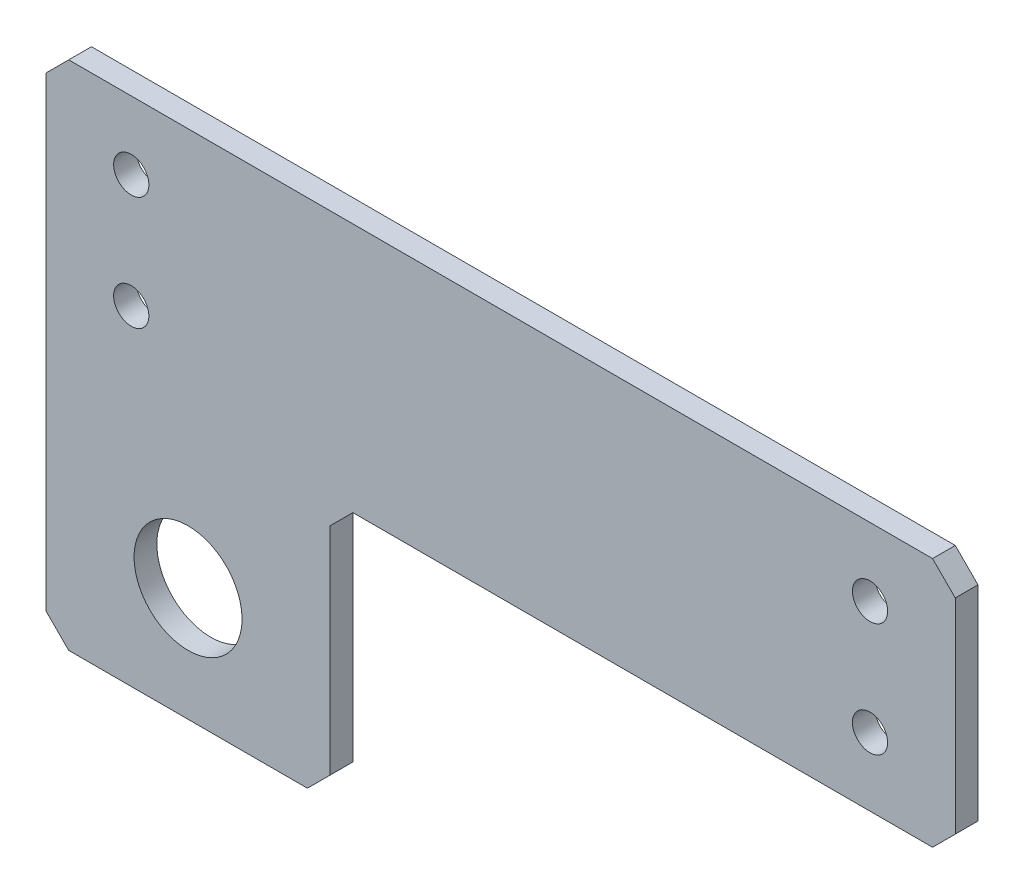
ISO-10303-21;
HEADER;
FILE_DESCRIPTION(('STEP AP214'),'2;1');
FILE_NAME('part.step','',(''),(''),'','','');
FILE_SCHEMA(('AUTOMOTIVE_DESIGN { 1 0 10303 214 1 1 1 1 }'));
ENDSEC;
DATA;
#1=APPLICATION_CONTEXT('core data for automotive mechanical design processes');
#2=APPLICATION_PROTOCOL_DEFINITION('international standard','automotive_design',2000,#1);
#3=PRODUCT_CONTEXT('',#1,'mechanical');
#4=PRODUCT('Part','Part','',(#3));
#5=PRODUCT_RELATED_PRODUCT_CATEGORY('part','',(#4));
#6=PRODUCT_DEFINITION_FORMATION('','',#4);
#7=PRODUCT_DEFINITION_CONTEXT('part definition',#1,'design');
#8=PRODUCT_DEFINITION('design','',#6,#7);
#9=PRODUCT_DEFINITION_SHAPE('','',#8);
#10=(LENGTH_UNIT() NAMED_UNIT(*) SI_UNIT(.MILLI.,.METRE.));
#11=(NAMED_UNIT(*) PLANE_ANGLE_UNIT() SI_UNIT($,.RADIAN.));
#12=(NAMED_UNIT(*) SI_UNIT($,.STERADIAN.) SOLID_ANGLE_UNIT());
#13=UNCERTAINTY_MEASURE_WITH_UNIT(LENGTH_MEASURE(1.E-05),#10,'distance_accuracy_value','');
#14=(GEOMETRIC_REPRESENTATION_CONTEXT(3) GLOBAL_UNCERTAINTY_ASSIGNED_CONTEXT((#13)) GLOBAL_UNIT_ASSIGNED_CONTEXT((#10,
#11,#12)) REPRESENTATION_CONTEXT('',''));
#15=CARTESIAN_POINT('',(0.,0.,0.));
#16=DIRECTION('',(0.,0.,1.));
#17=DIRECTION('',(1.,0.,0.));
#18=AXIS2_PLACEMENT_3D('',#15,#16,#17);
#19=CARTESIAN_POINT('',(-65.,8.,0.));
#20=DIRECTION('',(0.,0.,1.));
#21=DIRECTION('',(1.,0.,0.));
#22=AXIS2_PLACEMENT_3D('',#19,#20,#21);
#23=CYLINDRICAL_SURFACE('',#22,3.1);
#24=CARTESIAN_POINT('',(-65.,8.,0.));
#25=DIRECTION('',(0.,0.,1.));
#26=DIRECTION('',(1.,0.,0.));
#27=AXIS2_PLACEMENT_3D('',#24,#25,#26);
#28=CIRCLE('',#27,3.1);
#29=CARTESIAN_POINT('',(-61.9,8.,0.));
#30=VERTEX_POINT('',#29);
#31=EDGE_CURVE('E210',#30,#30,#28,.T.);
#32=ORIENTED_EDGE('',*,*,#31,.F.);
#33=EDGE_LOOP('',(#32));
#34=FACE_BOUND('',#33,.T.);
#35=CARTESIAN_POINT('',(-65.,8.,4.));
#36=DIRECTION('',(0.,0.,1.));
#37=DIRECTION('',(1.,0.,0.));
#38=AXIS2_PLACEMENT_3D('',#35,#36,#37);
#39=CIRCLE('',#38,3.1);
#40=CARTESIAN_POINT('',(-61.9,8.,4.));
#41=VERTEX_POINT('',#40);
#42=EDGE_CURVE('E213',#41,#41,#39,.T.);
#43=ORIENTED_EDGE('',*,*,#42,.T.);
#44=EDGE_LOOP('',(#43));
#45=FACE_BOUND('',#44,.T.);
#46=ADVANCED_FACE('F39',(#34,#45),#23,.F.);
#47=CARTESIAN_POINT('',(-65.,28.,0.));
#48=DIRECTION('',(0.,0.,1.));
#49=DIRECTION('',(1.,0.,0.));
#50=AXIS2_PLACEMENT_3D('',#47,#48,#49);
#51=CYLINDRICAL_SURFACE('',#50,3.1);
#52=CARTESIAN_POINT('',(-65.,28.,0.));
#53=DIRECTION('',(0.,0.,1.));
#54=DIRECTION('',(1.,0.,0.));
#55=AXIS2_PLACEMENT_3D('',#52,#53,#54);
#56=CIRCLE('',#55,3.1);
#57=CARTESIAN_POINT('',(-61.9,28.,0.));
#58=VERTEX_POINT('',#57);
#59=EDGE_CURVE('E199',#58,#58,#56,.T.);
#60=ORIENTED_EDGE('',*,*,#59,.F.);
#61=EDGE_LOOP('',(#60));
#62=FACE_BOUND('',#61,.T.);
#63=CARTESIAN_POINT('',(-65.,28.,4.));
#64=DIRECTION('',(0.,0.,1.));
#65=DIRECTION('',(1.,0.,0.));
#66=AXIS2_PLACEMENT_3D('',#63,#64,#65);
#67=CIRCLE('',#66,3.1);
#68=CARTESIAN_POINT('',(-61.9,28.,4.));
#69=VERTEX_POINT('',#68);
#70=EDGE_CURVE('E207',#69,#69,#67,.T.);
#71=ORIENTED_EDGE('',*,*,#70,.T.);
#72=EDGE_LOOP('',(#71));
#73=FACE_BOUND('',#72,.T.);
#74=ADVANCED_FACE('F300',(#62,#73),#51,.F.);
#75=CARTESIAN_POINT('',(80.,-40.,4.));
#76=DIRECTION('',(-1.,0.,0.));
#77=DIRECTION('',(0.,0.,1.));
#78=AXIS2_PLACEMENT_3D('',#75,#76,#77);
#79=PLANE('',#78);
#80=DIRECTION('',(0.,1.,0.));
#81=VECTOR('',#80,1.);
#82=CARTESIAN_POINT('',(80.,-40.,4.));
#83=LINE('',#82,#81);
#84=CARTESIAN_POINT('',(80.,0.,4.));
#85=VERTEX_POINT('',#84);
#86=CARTESIAN_POINT('',(80.,36.,4.));
#87=VERTEX_POINT('',#86);
#88=EDGE_CURVE('E191',#85,#87,#83,.T.);
#89=ORIENTED_EDGE('',*,*,#88,.F.);
#90=DIRECTION('',(0.,0.,-1.));
#91=VECTOR('',#90,1.);
#92=CARTESIAN_POINT('',(80.,0.,4.));
#93=LINE('',#92,#91);
#94=CARTESIAN_POINT('',(80.,0.,0.));
#95=VERTEX_POINT('',#94);
#96=EDGE_CURVE('E247',#85,#95,#93,.T.);
#97=ORIENTED_EDGE('',*,*,#96,.T.);
#98=DIRECTION('',(0.,1.,0.));
#99=VECTOR('',#98,1.);
#100=CARTESIAN_POINT('',(80.,-40.,0.));
#101=LINE('',#100,#99);
#102=CARTESIAN_POINT('',(80.,36.,0.));
#103=VERTEX_POINT('',#102);
#104=EDGE_CURVE('E188',#95,#103,#101,.T.);
#105=ORIENTED_EDGE('',*,*,#104,.T.);
#106=DIRECTION('',(0.,0.,1.));
#107=VECTOR('',#106,1.);
#108=CARTESIAN_POINT('',(80.,36.,4.));
#109=LINE('',#108,#107);
#110=EDGE_CURVE('E245',#103,#87,#109,.T.);
#111=ORIENTED_EDGE('',*,*,#110,.T.);
#112=EDGE_LOOP('',(#89,#97,#105,#111));
#113=FACE_BOUND('',#112,.T.);
#114=ADVANCED_FACE('F287',(#113),#79,.F.);
#115=CARTESIAN_POINT('',(-80.,40.,4.));
#116=DIRECTION('',(0.,-1.,0.));
#117=DIRECTION('',(0.,0.,-1.));
#118=AXIS2_PLACEMENT_3D('',#115,#116,#117);
#119=PLANE('',#118);
#120=DIRECTION('',(-1.,0.,0.));
#121=VECTOR('',#120,1.);
#122=CARTESIAN_POINT('',(-80.,40.,4.));
#123=LINE('',#122,#121);
#124=CARTESIAN_POINT('',(76.,40.,4.));
#125=VERTEX_POINT('',#124);
#126=CARTESIAN_POINT('',(-76.,40.,4.));
#127=VERTEX_POINT('',#126);
#128=EDGE_CURVE('E193',#125,#127,#123,.T.);
#129=ORIENTED_EDGE('',*,*,#128,.F.);
#130=DIRECTION('',(0.,0.,-1.));
#131=VECTOR('',#130,1.);
#132=CARTESIAN_POINT('',(76.,40.,4.));
#133=LINE('',#132,#131);
#134=CARTESIAN_POINT('',(76.,40.,0.));
#135=VERTEX_POINT('',#134);
#136=EDGE_CURVE('E250',#125,#135,#133,.T.);
#137=ORIENTED_EDGE('',*,*,#136,.T.);
#138=DIRECTION('',(-1.,0.,0.));
#139=VECTOR('',#138,1.);
#140=CARTESIAN_POINT('',(-80.,40.,0.));
#141=LINE('',#140,#139);
#142=CARTESIAN_POINT('',(-76.,40.,0.));
#143=VERTEX_POINT('',#142);
#144=EDGE_CURVE('E202',#135,#143,#141,.T.);
#145=ORIENTED_EDGE('',*,*,#144,.T.);
#146=DIRECTION('',(0.,0.,1.));
#147=VECTOR('',#146,1.);
#148=CARTESIAN_POINT('',(-76.,40.,4.));
#149=LINE('',#148,#147);
#150=EDGE_CURVE('E55',#143,#127,#149,.T.);
#151=ORIENTED_EDGE('',*,*,#150,.T.);
#152=EDGE_LOOP('',(#129,#137,#145,#151));
#153=FACE_BOUND('',#152,.T.);
#154=ADVANCED_FACE('F278',(#153),#119,.F.);
#155=CARTESIAN_POINT('',(-80.,-40.,4.));
#156=DIRECTION('',(1.,0.,0.));
#157=DIRECTION('',(0.,0.,-1.));
#158=AXIS2_PLACEMENT_3D('',#155,#156,#157);
#159=PLANE('',#158);
#160=DIRECTION('',(0.,-1.,0.));
#161=VECTOR('',#160,1.);
#162=CARTESIAN_POINT('',(-80.,-40.,0.));
#163=LINE('',#162,#161);
#164=CARTESIAN_POINT('',(-80.,36.,0.));
#165=VERTEX_POINT('',#164);
#166=CARTESIAN_POINT('',(-80.,-46.,0.));
#167=VERTEX_POINT('',#166);
#168=EDGE_CURVE('E194',#165,#167,#163,.T.);
#169=ORIENTED_EDGE('',*,*,#168,.T.);
#170=DIRECTION('',(0.,0.,1.));
#171=VECTOR('',#170,1.);
#172=CARTESIAN_POINT('',(-80.,-46.,4.));
#173=LINE('',#172,#171);
#174=CARTESIAN_POINT('',(-80.,-46.,4.));
#175=VERTEX_POINT('',#174);
#176=EDGE_CURVE('E135',#167,#175,#173,.T.);
#177=ORIENTED_EDGE('',*,*,#176,.T.);
#178=DIRECTION('',(0.,-1.,0.));
#179=VECTOR('',#178,1.);
#180=CARTESIAN_POINT('',(-80.,-40.,4.));
#181=LINE('',#180,#179);
#182=CARTESIAN_POINT('',(-80.,36.,4.));
#183=VERTEX_POINT('',#182);
#184=EDGE_CURVE('E196',#183,#175,#181,.T.);
#185=ORIENTED_EDGE('',*,*,#184,.F.);
#186=DIRECTION('',(0.,0.,-1.));
#187=VECTOR('',#186,1.);
#188=CARTESIAN_POINT('',(-80.,36.,4.));
#189=LINE('',#188,#187);
#190=EDGE_CURVE('E140',#183,#165,#189,.T.);
#191=ORIENTED_EDGE('',*,*,#190,.T.);
#192=EDGE_LOOP('',(#169,#177,#185,#191));
#193=FACE_BOUND('',#192,.T.);
#194=ADVANCED_FACE('F275',(#193),#159,.F.);
#195=CARTESIAN_POINT('',(0.,0.,4.));
#196=DIRECTION('',(0.,0.,-1.));
#197=DIRECTION('',(-1.,0.,0.));
#198=AXIS2_PLACEMENT_3D('',#195,#196,#197);
#199=PLANE('',#198);
#200=CARTESIAN_POINT('',(-55.,-30.,4.));
#201=DIRECTION('',(0.,0.,1.));
#202=DIRECTION('',(1.,0.,0.));
#203=AXIS2_PLACEMENT_3D('',#200,#201,#202);
#204=CIRCLE('',#203,9.5);
#205=CARTESIAN_POINT('',(-45.5,-30.,4.));
#206=VERTEX_POINT('',#205);
#207=EDGE_CURVE('E164',#206,#206,#204,.T.);
#208=ORIENTED_EDGE('',*,*,#207,.F.);
#209=EDGE_LOOP('',(#208));
#210=FACE_BOUND('',#209,.T.);
#211=CARTESIAN_POINT('',(65.,8.,4.));
#212=DIRECTION('',(0.,0.,1.));
#213=DIRECTION('',(1.,0.,0.));
#214=AXIS2_PLACEMENT_3D('',#211,#212,#213);
#215=CIRCLE('',#214,3.1);
#216=CARTESIAN_POINT('',(68.1,8.,4.));
#217=VERTEX_POINT('',#216);
#218=EDGE_CURVE('E181',#217,#217,#215,.T.);
#219=ORIENTED_EDGE('',*,*,#218,.F.);
#220=EDGE_LOOP('',(#219));
#221=FACE_BOUND('',#220,.T.);
#222=CARTESIAN_POINT('',(65.,28.,4.));
#223=DIRECTION('',(0.,0.,1.));
#224=DIRECTION('',(1.,0.,0.));
#225=AXIS2_PLACEMENT_3D('',#222,#223,#224);
#226=CIRCLE('',#225,3.1);
#227=CARTESIAN_POINT('',(68.1,28.,4.));
#228=VERTEX_POINT('',#227);
#229=EDGE_CURVE('E184',#228,#228,#226,.T.);
#230=ORIENTED_EDGE('',*,*,#229,.F.);
#231=EDGE_LOOP('',(#230));
#232=FACE_BOUND('',#231,.T.);
#233=ORIENTED_EDGE('',*,*,#184,.T.);
#234=DIRECTION('',(-0.707106781186548,0.707106781186548,0.));
#235=VECTOR('',#234,1.);
#236=CARTESIAN_POINT('',(-76.,-50.,4.));
#237=LINE('',#236,#235);
#238=CARTESIAN_POINT('',(-76.,-50.,4.));
#239=VERTEX_POINT('',#238);
#240=EDGE_CURVE('E233',#175,#239,#237,.F.);
#241=ORIENTED_EDGE('',*,*,#240,.T.);
#242=DIRECTION('',(-1.,0.,0.));
#243=VECTOR('',#242,1.);
#244=CARTESIAN_POINT('',(-80.,-50.,4.));
#245=LINE('',#244,#243);
#246=CARTESIAN_POINT('',(-34.,-50.,4.));
#247=VERTEX_POINT('',#246);
#248=EDGE_CURVE('E151',#247,#239,#245,.T.);
#249=ORIENTED_EDGE('',*,*,#248,.F.);
#250=DIRECTION('',(-0.707106781186548,-0.707106781186548,0.));
#251=VECTOR('',#250,1.);
#252=CARTESIAN_POINT('',(-34.,-50.,4.));
#253=LINE('',#252,#251);
#254=CARTESIAN_POINT('',(-30.,-46.,4.));
#255=VERTEX_POINT('',#254);
#256=EDGE_CURVE('E231',#247,#255,#253,.F.);
#257=ORIENTED_EDGE('',*,*,#256,.T.);
#258=DIRECTION('',(0.,-1.,0.));
#259=VECTOR('',#258,1.);
#260=CARTESIAN_POINT('',(-30.,-4.00000000000002,4.));
#261=LINE('',#260,#259);
#262=CARTESIAN_POINT('',(-30.,-8.00000000000002,4.));
#263=VERTEX_POINT('',#262);
#264=EDGE_CURVE('E172',#263,#255,#261,.T.);
#265=ORIENTED_EDGE('',*,*,#264,.F.);
#266=DIRECTION('',(-0.707106781186545,-0.70710678118655,0.));
#267=VECTOR('',#266,1.);
#268=CARTESIAN_POINT('',(-11.0000000000001,11.,4.));
#269=LINE('',#268,#267);
#270=CARTESIAN_POINT('',(-26.,-4.00000000000002,4.));
#271=VERTEX_POINT('',#270);
#272=EDGE_CURVE('E48',#263,#271,#269,.F.);
#273=ORIENTED_EDGE('',*,*,#272,.T.);
#274=DIRECTION('',(-1.,0.,0.));
#275=VECTOR('',#274,1.);
#276=CARTESIAN_POINT('',(80.,-4.,4.));
#277=LINE('',#276,#275);
#278=CARTESIAN_POINT('',(76.,-4.,4.));
#279=VERTEX_POINT('',#278);
#280=EDGE_CURVE('E161',#279,#271,#277,.T.);
#281=ORIENTED_EDGE('',*,*,#280,.F.);
#282=DIRECTION('',(-0.707106781186545,-0.70710678118655,0.));
#283=VECTOR('',#282,1.);
#284=CARTESIAN_POINT('',(76.,-4.,4.));
#285=LINE('',#284,#283);
#286=EDGE_CURVE('E229',#279,#85,#285,.F.);
#287=ORIENTED_EDGE('',*,*,#286,.T.);
#288=ORIENTED_EDGE('',*,*,#88,.T.);
#289=DIRECTION('',(0.707106781186548,-0.707106781186548,0.));
#290=VECTOR('',#289,1.);
#291=CARTESIAN_POINT('',(76.,40.,4.));
#292=LINE('',#291,#290);
#293=EDGE_CURVE('E62',#87,#125,#292,.F.);
#294=ORIENTED_EDGE('',*,*,#293,.T.);
#295=ORIENTED_EDGE('',*,*,#128,.T.);
#296=DIRECTION('',(0.707106781186548,0.707106781186548,0.));
#297=VECTOR('',#296,1.);
#298=CARTESIAN_POINT('',(-80.,36.,4.));
#299=LINE('',#298,#297);
#300=EDGE_CURVE('E226',#127,#183,#299,.F.);
#301=ORIENTED_EDGE('',*,*,#300,.T.);
#302=EDGE_LOOP('',(#233,#241,#249,#257,#265,#273,#281,#287,#288,#294,#295,#301));
#303=FACE_BOUND('',#302,.T.);
#304=ORIENTED_EDGE('',*,*,#70,.F.);
#305=EDGE_LOOP('',(#304));
#306=FACE_BOUND('',#305,.T.);
#307=ORIENTED_EDGE('',*,*,#42,.F.);
#308=EDGE_LOOP('',(#307));
#309=FACE_BOUND('',#308,.T.);
#310=ADVANCED_FACE('F254',(#210,#221,#232,#303,#306,#309),#199,.F.);
#311=CARTESIAN_POINT('',(0.,0.,0.));
#312=DIRECTION('',(0.,0.,-1.));
#313=DIRECTION('',(-1.,0.,0.));
#314=AXIS2_PLACEMENT_3D('',#311,#312,#313);
#315=PLANE('',#314);
#316=CARTESIAN_POINT('',(-55.,-30.,0.));
#317=DIRECTION('',(0.,0.,1.));
#318=DIRECTION('',(1.,0.,0.));
#319=AXIS2_PLACEMENT_3D('',#316,#317,#318);
#320=CIRCLE('',#319,9.5);
#321=CARTESIAN_POINT('',(-45.5,-30.,0.));
#322=VERTEX_POINT('',#321);
#323=EDGE_CURVE('E159',#322,#322,#320,.T.);
#324=ORIENTED_EDGE('',*,*,#323,.T.);
#325=EDGE_LOOP('',(#324));
#326=FACE_BOUND('',#325,.T.);
#327=DIRECTION('',(1.,0.,0.));
#328=VECTOR('',#327,1.);
#329=CARTESIAN_POINT('',(-80.,-50.,0.));
#330=LINE('',#329,#328);
#331=CARTESIAN_POINT('',(-76.,-50.,0.));
#332=VERTEX_POINT('',#331);
#333=CARTESIAN_POINT('',(-34.,-50.,0.));
#334=VERTEX_POINT('',#333);
#335=EDGE_CURVE('E148',#332,#334,#330,.T.);
#336=ORIENTED_EDGE('',*,*,#335,.F.);
#337=DIRECTION('',(0.707106781186548,-0.707106781186548,0.));
#338=VECTOR('',#337,1.);
#339=CARTESIAN_POINT('',(-63.,-63.,0.));
#340=LINE('',#339,#338);
#341=EDGE_CURVE('E130',#332,#167,#340,.F.);
#342=ORIENTED_EDGE('',*,*,#341,.T.);
#343=ORIENTED_EDGE('',*,*,#168,.F.);
#344=DIRECTION('',(-0.707106781186548,-0.707106781186548,0.));
#345=VECTOR('',#344,1.);
#346=CARTESIAN_POINT('',(-58.,58.,0.));
#347=LINE('',#346,#345);
#348=EDGE_CURVE('E152',#165,#143,#347,.F.);
#349=ORIENTED_EDGE('',*,*,#348,.T.);
#350=ORIENTED_EDGE('',*,*,#144,.F.);
#351=DIRECTION('',(-0.707106781186548,0.707106781186548,0.));
#352=VECTOR('',#351,1.);
#353=CARTESIAN_POINT('',(58.,58.,0.));
#354=LINE('',#353,#352);
#355=EDGE_CURVE('E218',#135,#103,#354,.F.);
#356=ORIENTED_EDGE('',*,*,#355,.T.);
#357=ORIENTED_EDGE('',*,*,#104,.F.);
#358=DIRECTION('',(0.707106781186545,0.70710678118655,0.));
#359=VECTOR('',#358,1.);
#360=CARTESIAN_POINT('',(40.0000000000003,-40.,0.));
#361=LINE('',#360,#359);
#362=CARTESIAN_POINT('',(76.,-4.,0.));
#363=VERTEX_POINT('',#362);
#364=EDGE_CURVE('E220',#95,#363,#361,.F.);
#365=ORIENTED_EDGE('',*,*,#364,.T.);
#366=DIRECTION('',(-1.,0.,0.));
#367=VECTOR('',#366,1.);
#368=CARTESIAN_POINT('',(80.,-4.,0.));
#369=LINE('',#368,#367);
#370=CARTESIAN_POINT('',(-26.,-4.00000000000002,0.));
#371=VERTEX_POINT('',#370);
#372=EDGE_CURVE('E168',#363,#371,#369,.T.);
#373=ORIENTED_EDGE('',*,*,#372,.T.);
#374=DIRECTION('',(0.707106781186545,0.70710678118655,0.));
#375=VECTOR('',#374,1.);
#376=CARTESIAN_POINT('',(-30.,-8.00000000000002,0.));
#377=LINE('',#376,#375);
#378=CARTESIAN_POINT('',(-30.,-8.00000000000002,0.));
#379=VERTEX_POINT('',#378);
#380=EDGE_CURVE('E11',#371,#379,#377,.F.);
#381=ORIENTED_EDGE('',*,*,#380,.T.);
#382=DIRECTION('',(0.,-1.,0.));
#383=VECTOR('',#382,1.);
#384=CARTESIAN_POINT('',(-30.,-4.00000000000002,0.));
#385=LINE('',#384,#383);
#386=CARTESIAN_POINT('',(-30.,-46.,0.));
#387=VERTEX_POINT('',#386);
#388=EDGE_CURVE('E171',#379,#387,#385,.T.);
#389=ORIENTED_EDGE('',*,*,#388,.T.);
#390=DIRECTION('',(0.707106781186548,0.707106781186548,0.));
#391=VECTOR('',#390,1.);
#392=CARTESIAN_POINT('',(7.99999999999998,-7.99999999999998,0.));
#393=LINE('',#392,#391);
#394=EDGE_CURVE('E141',#387,#334,#393,.F.);
#395=ORIENTED_EDGE('',*,*,#394,.T.);
#396=EDGE_LOOP('',(#336,#342,#343,#349,#350,#356,#357,#365,#373,#381,#389,#395));
#397=FACE_BOUND('',#396,.T.);
#398=CARTESIAN_POINT('',(65.,8.,0.));
#399=DIRECTION('',(0.,0.,1.));
#400=DIRECTION('',(1.,0.,0.));
#401=AXIS2_PLACEMENT_3D('',#398,#399,#400);
#402=CIRCLE('',#401,3.1);
#403=CARTESIAN_POINT('',(68.1,8.,0.));
#404=VERTEX_POINT('',#403);
#405=EDGE_CURVE('E174',#404,#404,#402,.T.);
#406=ORIENTED_EDGE('',*,*,#405,.T.);
#407=EDGE_LOOP('',(#406));
#408=FACE_BOUND('',#407,.T.);
#409=CARTESIAN_POINT('',(65.,28.,0.));
#410=DIRECTION('',(0.,0.,1.));
#411=DIRECTION('',(1.,0.,0.));
#412=AXIS2_PLACEMENT_3D('',#409,#410,#411);
#413=CIRCLE('',#412,3.1);
#414=CARTESIAN_POINT('',(68.1,28.,0.));
#415=VERTEX_POINT('',#414);
#416=EDGE_CURVE('E185',#415,#415,#413,.T.);
#417=ORIENTED_EDGE('',*,*,#416,.T.);
#418=EDGE_LOOP('',(#417));
#419=FACE_BOUND('',#418,.T.);
#420=ORIENTED_EDGE('',*,*,#59,.T.);
#421=EDGE_LOOP('',(#420));
#422=FACE_BOUND('',#421,.T.);
#423=ORIENTED_EDGE('',*,*,#31,.T.);
#424=EDGE_LOOP('',(#423));
#425=FACE_BOUND('',#424,.T.);
#426=ADVANCED_FACE('F155',(#326,#397,#408,#419,#422,#425),#315,.T.);
#427=CARTESIAN_POINT('',(65.,28.,0.));
#428=DIRECTION('',(0.,0.,1.));
#429=DIRECTION('',(1.,0.,0.));
#430=AXIS2_PLACEMENT_3D('',#427,#428,#429);
#431=CYLINDRICAL_SURFACE('',#430,3.1);
#432=ORIENTED_EDGE('',*,*,#416,.F.);
#433=EDGE_LOOP('',(#432));
#434=FACE_BOUND('',#433,.T.);
#435=ORIENTED_EDGE('',*,*,#229,.T.);
#436=EDGE_LOOP('',(#435));
#437=FACE_BOUND('',#436,.T.);
#438=ADVANCED_FACE('F381',(#434,#437),#431,.F.);
#439=CARTESIAN_POINT('',(65.,8.,0.));
#440=DIRECTION('',(0.,0.,1.));
#441=DIRECTION('',(1.,0.,0.));
#442=AXIS2_PLACEMENT_3D('',#439,#440,#441);
#443=CYLINDRICAL_SURFACE('',#442,3.1);
#444=ORIENTED_EDGE('',*,*,#405,.F.);
#445=EDGE_LOOP('',(#444));
#446=FACE_BOUND('',#445,.T.);
#447=ORIENTED_EDGE('',*,*,#218,.T.);
#448=EDGE_LOOP('',(#447));
#449=FACE_BOUND('',#448,.T.);
#450=ADVANCED_FACE('F402',(#446,#449),#443,.F.);
#451=CARTESIAN_POINT('',(-30.,-4.00000000000002,0.));
#452=DIRECTION('',(-1.,0.,0.));
#453=DIRECTION('',(0.,0.,1.));
#454=AXIS2_PLACEMENT_3D('',#451,#452,#453);
#455=PLANE('',#454);
#456=ORIENTED_EDGE('',*,*,#264,.T.);
#457=DIRECTION('',(0.,0.,-1.));
#458=VECTOR('',#457,1.);
#459=CARTESIAN_POINT('',(-30.,-46.,0.));
#460=LINE('',#459,#458);
#461=EDGE_CURVE('E238',#255,#387,#460,.T.);
#462=ORIENTED_EDGE('',*,*,#461,.T.);
#463=ORIENTED_EDGE('',*,*,#388,.F.);
#464=DIRECTION('',(0.,0.,1.));
#465=VECTOR('',#464,1.);
#466=CARTESIAN_POINT('',(-30.,-8.00000000000002,4.));
#467=LINE('',#466,#465);
#468=EDGE_CURVE('E235',#379,#263,#467,.T.);
#469=ORIENTED_EDGE('',*,*,#468,.T.);
#470=EDGE_LOOP('',(#456,#462,#463,#469));
#471=FACE_BOUND('',#470,.T.);
#472=ADVANCED_FACE('F267',(#471),#455,.F.);
#473=CARTESIAN_POINT('',(80.,-4.,0.));
#474=DIRECTION('',(0.,1.,0.));
#475=DIRECTION('',(-1.,0.,0.));
#476=AXIS2_PLACEMENT_3D('',#473,#474,#475);
#477=PLANE('',#476);
#478=ORIENTED_EDGE('',*,*,#280,.T.);
#479=DIRECTION('',(0.,0.,-1.));
#480=VECTOR('',#479,1.);
#481=CARTESIAN_POINT('',(-26.,-4.00000000000002,0.));
#482=LINE('',#481,#480);
#483=EDGE_CURVE('E243',#271,#371,#482,.T.);
#484=ORIENTED_EDGE('',*,*,#483,.T.);
#485=ORIENTED_EDGE('',*,*,#372,.F.);
#486=DIRECTION('',(0.,0.,1.));
#487=VECTOR('',#486,1.);
#488=CARTESIAN_POINT('',(76.,-4.,0.));
#489=LINE('',#488,#487);
#490=EDGE_CURVE('E240',#363,#279,#489,.T.);
#491=ORIENTED_EDGE('',*,*,#490,.T.);
#492=EDGE_LOOP('',(#478,#484,#485,#491));
#493=FACE_BOUND('',#492,.T.);
#494=ADVANCED_FACE('F260',(#493),#477,.F.);
#495=CARTESIAN_POINT('',(0.,-50.,0.));
#496=DIRECTION('',(0.,1.,0.));
#497=DIRECTION('',(0.,0.,1.));
#498=AXIS2_PLACEMENT_3D('',#495,#496,#497);
#499=PLANE('',#498);
#500=ORIENTED_EDGE('',*,*,#248,.T.);
#501=DIRECTION('',(0.,0.,-1.));
#502=VECTOR('',#501,1.);
#503=CARTESIAN_POINT('',(-76.,-50.,0.));
#504=LINE('',#503,#502);
#505=EDGE_CURVE('E134',#239,#332,#504,.T.);
#506=ORIENTED_EDGE('',*,*,#505,.T.);
#507=ORIENTED_EDGE('',*,*,#335,.T.);
#508=DIRECTION('',(0.,0.,1.));
#509=VECTOR('',#508,1.);
#510=CARTESIAN_POINT('',(-34.,-50.,0.));
#511=LINE('',#510,#509);
#512=EDGE_CURVE('E153',#334,#247,#511,.T.);
#513=ORIENTED_EDGE('',*,*,#512,.T.);
#514=EDGE_LOOP('',(#500,#506,#507,#513));
#515=FACE_BOUND('',#514,.T.);
#516=ADVANCED_FACE('F146',(#515),#499,.F.);
#517=CARTESIAN_POINT('',(-76.,-50.,0.));
#518=DIRECTION('',(0.707106781186547,0.707106781186547,0.));
#519=DIRECTION('',(0.,0.,-1.));
#520=AXIS2_PLACEMENT_3D('',#517,#518,#519);
#521=PLANE('',#520);
#522=ORIENTED_EDGE('',*,*,#240,.F.);
#523=ORIENTED_EDGE('',*,*,#176,.F.);
#524=ORIENTED_EDGE('',*,*,#341,.F.);
#525=ORIENTED_EDGE('',*,*,#505,.F.);
#526=EDGE_LOOP('',(#522,#523,#524,#525));
#527=FACE_BOUND('',#526,.T.);
#528=ADVANCED_FACE('F133',(#527),#521,.F.);
#529=CARTESIAN_POINT('',(-34.,-50.,0.));
#530=DIRECTION('',(-0.707106781186547,0.707106781186547,0.));
#531=DIRECTION('',(0.,0.,1.));
#532=AXIS2_PLACEMENT_3D('',#529,#530,#531);
#533=PLANE('',#532);
#534=ORIENTED_EDGE('',*,*,#394,.F.);
#535=ORIENTED_EDGE('',*,*,#461,.F.);
#536=ORIENTED_EDGE('',*,*,#256,.F.);
#537=ORIENTED_EDGE('',*,*,#512,.F.);
#538=EDGE_LOOP('',(#534,#535,#536,#537));
#539=FACE_BOUND('',#538,.T.);
#540=ADVANCED_FACE('F270',(#539),#533,.F.);
#541=CARTESIAN_POINT('',(-30.,-8.00000000000002,0.));
#542=DIRECTION('',(0.70710678118655,-0.707106781186545,0.));
#543=DIRECTION('',(0.,0.,-1.));
#544=AXIS2_PLACEMENT_3D('',#541,#542,#543);
#545=PLANE('',#544);
#546=ORIENTED_EDGE('',*,*,#380,.F.);
#547=ORIENTED_EDGE('',*,*,#483,.F.);
#548=ORIENTED_EDGE('',*,*,#272,.F.);
#549=ORIENTED_EDGE('',*,*,#468,.F.);
#550=EDGE_LOOP('',(#546,#547,#548,#549));
#551=FACE_BOUND('',#550,.T.);
#552=ADVANCED_FACE('F264',(#551),#545,.T.);
#553=CARTESIAN_POINT('',(76.,-4.,0.));
#554=DIRECTION('',(-0.70710678118655,0.707106781186545,0.));
#555=DIRECTION('',(0.,0.,1.));
#556=AXIS2_PLACEMENT_3D('',#553,#554,#555);
#557=PLANE('',#556);
#558=ORIENTED_EDGE('',*,*,#364,.F.);
#559=ORIENTED_EDGE('',*,*,#96,.F.);
#560=ORIENTED_EDGE('',*,*,#286,.F.);
#561=ORIENTED_EDGE('',*,*,#490,.F.);
#562=EDGE_LOOP('',(#558,#559,#560,#561));
#563=FACE_BOUND('',#562,.T.);
#564=ADVANCED_FACE('F290',(#563),#557,.F.);
#565=CARTESIAN_POINT('',(76.,40.,4.));
#566=DIRECTION('',(-0.707106781186547,-0.707106781186547,0.));
#567=DIRECTION('',(0.,0.,-1.));
#568=AXIS2_PLACEMENT_3D('',#565,#566,#567);
#569=PLANE('',#568);
#570=ORIENTED_EDGE('',*,*,#293,.F.);
#571=ORIENTED_EDGE('',*,*,#110,.F.);
#572=ORIENTED_EDGE('',*,*,#355,.F.);
#573=ORIENTED_EDGE('',*,*,#136,.F.);
#574=EDGE_LOOP('',(#570,#571,#572,#573));
#575=FACE_BOUND('',#574,.T.);
#576=ADVANCED_FACE('F281',(#575),#569,.F.);
#577=CARTESIAN_POINT('',(-80.,36.,4.));
#578=DIRECTION('',(0.707106781186547,-0.707106781186547,0.));
#579=DIRECTION('',(0.,0.,-1.));
#580=AXIS2_PLACEMENT_3D('',#577,#578,#579);
#581=PLANE('',#580);
#582=ORIENTED_EDGE('',*,*,#300,.F.);
#583=ORIENTED_EDGE('',*,*,#150,.F.);
#584=ORIENTED_EDGE('',*,*,#348,.F.);
#585=ORIENTED_EDGE('',*,*,#190,.F.);
#586=EDGE_LOOP('',(#582,#583,#584,#585));
#587=FACE_BOUND('',#586,.T.);
#588=ADVANCED_FACE('F42',(#587),#581,.F.);
#589=CARTESIAN_POINT('',(-55.,-30.,0.));
#590=DIRECTION('',(0.,0.,1.));
#591=DIRECTION('',(1.,0.,0.));
#592=AXIS2_PLACEMENT_3D('',#589,#590,#591);
#593=CYLINDRICAL_SURFACE('',#592,9.5);
#594=ORIENTED_EDGE('',*,*,#323,.F.);
#595=EDGE_LOOP('',(#594));
#596=FACE_BOUND('',#595,.T.);
#597=ORIENTED_EDGE('',*,*,#207,.T.);
#598=EDGE_LOOP('',(#597));
#599=FACE_BOUND('',#598,.T.);
#600=ADVANCED_FACE('F359',(#596,#599),#593,.F.);
#601=CLOSED_SHELL('',(#46,#74,#114,#154,#194,#310,#426,#438,#450,#472,#494,#516,#528,#540,#552,
#564,#576,#588,#600));
#602=MANIFOLD_SOLID_BREP('B2',#601);
#603=ADVANCED_BREP_SHAPE_REPRESENTATION('',(#18,#602),#14);
#604=SHAPE_DEFINITION_REPRESENTATION(#9,#603);
ENDSEC;
END-ISO-10303-21;
